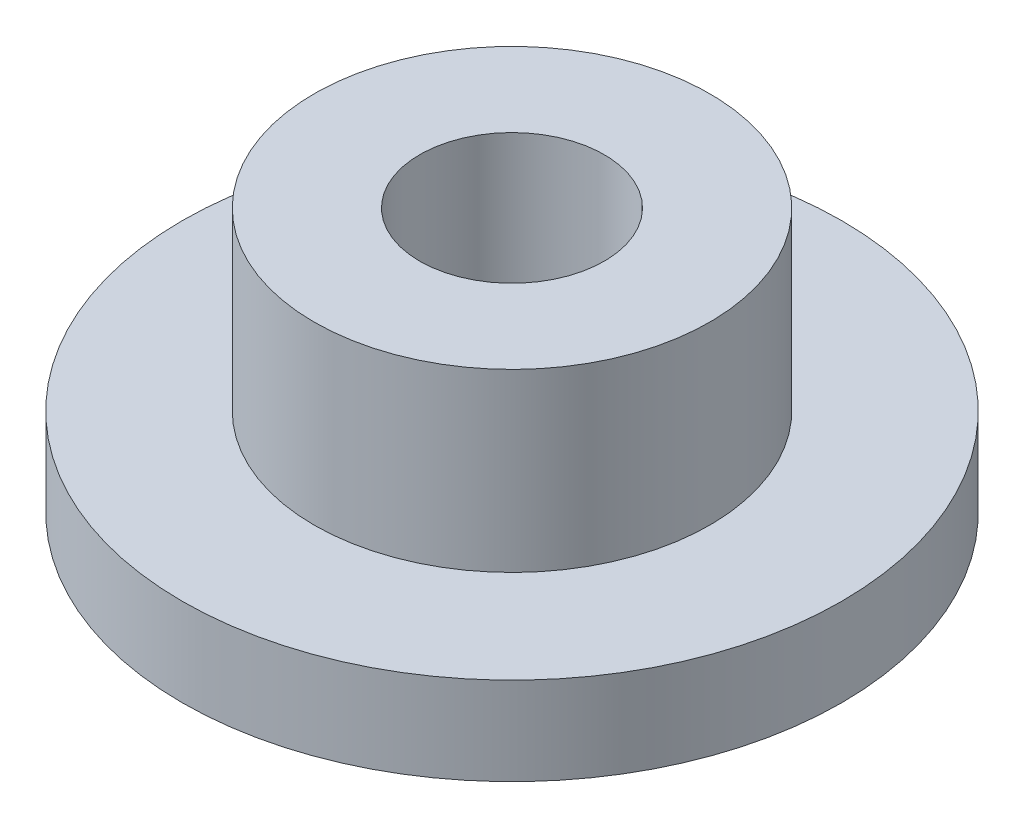
ISO-10303-21;
HEADER;
FILE_DESCRIPTION(('STEP AP214'),'2;1');
FILE_NAME('part.step','',(''),(''),'','','');
FILE_SCHEMA(('AUTOMOTIVE_DESIGN { 1 0 10303 214 1 1 1 1 }'));
ENDSEC;
DATA;
#1=APPLICATION_CONTEXT('core data for automotive mechanical design processes');
#2=APPLICATION_PROTOCOL_DEFINITION('international standard','automotive_design',2000,#1);
#3=PRODUCT_CONTEXT('',#1,'mechanical');
#4=PRODUCT('Part','Part','',(#3));
#5=PRODUCT_RELATED_PRODUCT_CATEGORY('part','',(#4));
#6=PRODUCT_DEFINITION_FORMATION('','',#4);
#7=PRODUCT_DEFINITION_CONTEXT('part definition',#1,'design');
#8=PRODUCT_DEFINITION('design','',#6,#7);
#9=PRODUCT_DEFINITION_SHAPE('','',#8);
#10=(LENGTH_UNIT() NAMED_UNIT(*) SI_UNIT(.MILLI.,.METRE.));
#11=(NAMED_UNIT(*) PLANE_ANGLE_UNIT() SI_UNIT($,.RADIAN.));
#12=(NAMED_UNIT(*) SI_UNIT($,.STERADIAN.) SOLID_ANGLE_UNIT());
#13=UNCERTAINTY_MEASURE_WITH_UNIT(LENGTH_MEASURE(1.E-05),#10,'distance_accuracy_value','');
#14=(GEOMETRIC_REPRESENTATION_CONTEXT(3) GLOBAL_UNCERTAINTY_ASSIGNED_CONTEXT((#13)) GLOBAL_UNIT_ASSIGNED_CONTEXT((#10,
#11,#12)) REPRESENTATION_CONTEXT('',''));
#15=CARTESIAN_POINT('',(0.,0.,0.));
#16=DIRECTION('',(0.,0.,1.));
#17=DIRECTION('',(1.,0.,0.));
#18=AXIS2_PLACEMENT_3D('',#15,#16,#17);
#19=CARTESIAN_POINT('',(0.,1.,0.));
#20=DIRECTION('',(0.,-1.,0.));
#21=DIRECTION('',(0.,0.,-1.));
#22=AXIS2_PLACEMENT_3D('',#19,#20,#21);
#23=CYLINDRICAL_SURFACE('',#22,3.75);
#24=CARTESIAN_POINT('',(0.,1.,0.));
#25=DIRECTION('',(0.,1.,0.));
#26=DIRECTION('',(0.,0.,1.));
#27=AXIS2_PLACEMENT_3D('',#24,#25,#26);
#28=CIRCLE('',#27,3.75);
#29=CARTESIAN_POINT('',(0.,1.,3.75));
#30=VERTEX_POINT('',#29);
#31=EDGE_CURVE('E47',#30,#30,#28,.T.);
#32=ORIENTED_EDGE('',*,*,#31,.F.);
#33=EDGE_LOOP('',(#32));
#34=FACE_BOUND('',#33,.T.);
#35=CARTESIAN_POINT('',(0.,0.,0.));
#36=DIRECTION('',(0.,1.,0.));
#37=DIRECTION('',(0.,0.,1.));
#38=AXIS2_PLACEMENT_3D('',#35,#36,#37);
#39=CIRCLE('',#38,3.75);
#40=CARTESIAN_POINT('',(0.,0.,3.75));
#41=VERTEX_POINT('',#40);
#42=EDGE_CURVE('E42',#41,#41,#39,.T.);
#43=ORIENTED_EDGE('',*,*,#42,.T.);
#44=EDGE_LOOP('',(#43));
#45=FACE_BOUND('',#44,.T.);
#46=ADVANCED_FACE('F39',(#34,#45),#23,.T.);
#47=CARTESIAN_POINT('',(0.,1.,0.));
#48=DIRECTION('',(0.,1.,0.));
#49=DIRECTION('',(0.,0.,1.));
#50=AXIS2_PLACEMENT_3D('',#47,#48,#49);
#51=PLANE('',#50);
#52=CARTESIAN_POINT('',(0.,1.,0.));
#53=DIRECTION('',(0.,1.,0.));
#54=DIRECTION('',(0.,0.,1.));
#55=AXIS2_PLACEMENT_3D('',#52,#53,#54);
#56=CIRCLE('',#55,2.25);
#57=CARTESIAN_POINT('',(0.,1.,2.25));
#58=VERTEX_POINT('',#57);
#59=EDGE_CURVE('E10',#58,#58,#56,.T.);
#60=ORIENTED_EDGE('',*,*,#59,.F.);
#61=EDGE_LOOP('',(#60));
#62=FACE_BOUND('',#61,.T.);
#63=ORIENTED_EDGE('',*,*,#31,.T.);
#64=EDGE_LOOP('',(#63));
#65=FACE_BOUND('',#64,.T.);
#66=ADVANCED_FACE('F82',(#62,#65),#51,.T.);
#67=CARTESIAN_POINT('',(0.,0.,0.));
#68=DIRECTION('',(0.,1.,0.));
#69=DIRECTION('',(0.,0.,1.));
#70=AXIS2_PLACEMENT_3D('',#67,#68,#69);
#71=PLANE('',#70);
#72=CARTESIAN_POINT('',(0.,0.,0.));
#73=DIRECTION('',(0.,1.,0.));
#74=DIRECTION('',(0.,0.,1.));
#75=AXIS2_PLACEMENT_3D('',#72,#73,#74);
#76=CIRCLE('',#75,1.05);
#77=CARTESIAN_POINT('',(0.,0.,1.05));
#78=VERTEX_POINT('',#77);
#79=EDGE_CURVE('E58',#78,#78,#76,.F.);
#80=ORIENTED_EDGE('',*,*,#79,.F.);
#81=EDGE_LOOP('',(#80));
#82=FACE_BOUND('',#81,.T.);
#83=ORIENTED_EDGE('',*,*,#42,.F.);
#84=EDGE_LOOP('',(#83));
#85=FACE_BOUND('',#84,.T.);
#86=ADVANCED_FACE('F77',(#82,#85),#71,.F.);
#87=CARTESIAN_POINT('',(0.,3.,0.));
#88=DIRECTION('',(0.,-1.,0.));
#89=DIRECTION('',(0.,0.,-1.));
#90=AXIS2_PLACEMENT_3D('',#87,#88,#89);
#91=CYLINDRICAL_SURFACE('',#90,2.25);
#92=CARTESIAN_POINT('',(0.,3.,0.));
#93=DIRECTION('',(0.,1.,0.));
#94=DIRECTION('',(0.,0.,1.));
#95=AXIS2_PLACEMENT_3D('',#92,#93,#94);
#96=CIRCLE('',#95,2.25);
#97=CARTESIAN_POINT('',(0.,3.,2.25));
#98=VERTEX_POINT('',#97);
#99=EDGE_CURVE('E54',#98,#98,#96,.T.);
#100=ORIENTED_EDGE('',*,*,#99,.F.);
#101=EDGE_LOOP('',(#100));
#102=FACE_BOUND('',#101,.T.);
#103=ORIENTED_EDGE('',*,*,#59,.T.);
#104=EDGE_LOOP('',(#103));
#105=FACE_BOUND('',#104,.T.);
#106=ADVANCED_FACE('F72',(#102,#105),#91,.T.);
#107=CARTESIAN_POINT('',(0.,3.,0.));
#108=DIRECTION('',(0.,1.,0.));
#109=DIRECTION('',(0.,0.,1.));
#110=AXIS2_PLACEMENT_3D('',#107,#108,#109);
#111=PLANE('',#110);
#112=CARTESIAN_POINT('',(0.,3.,0.));
#113=DIRECTION('',(0.,1.,0.));
#114=DIRECTION('',(0.,0.,1.));
#115=AXIS2_PLACEMENT_3D('',#112,#113,#114);
#116=CIRCLE('',#115,1.05);
#117=CARTESIAN_POINT('',(0.,3.,1.05));
#118=VERTEX_POINT('',#117);
#119=EDGE_CURVE('E62',#118,#118,#116,.T.);
#120=ORIENTED_EDGE('',*,*,#119,.F.);
#121=EDGE_LOOP('',(#120));
#122=FACE_BOUND('',#121,.T.);
#123=ORIENTED_EDGE('',*,*,#99,.T.);
#124=EDGE_LOOP('',(#123));
#125=FACE_BOUND('',#124,.T.);
#126=ADVANCED_FACE('F69',(#122,#125),#111,.T.);
#127=CARTESIAN_POINT('',(0.,-2.9698484809835,0.));
#128=DIRECTION('',(0.,1.,0.));
#129=DIRECTION('',(0.,0.,1.));
#130=AXIS2_PLACEMENT_3D('',#127,#128,#129);
#131=CYLINDRICAL_SURFACE('',#130,1.05);
#132=ORIENTED_EDGE('',*,*,#79,.T.);
#133=EDGE_LOOP('',(#132));
#134=FACE_BOUND('',#133,.T.);
#135=ORIENTED_EDGE('',*,*,#119,.T.);
#136=EDGE_LOOP('',(#135));
#137=FACE_BOUND('',#136,.T.);
#138=ADVANCED_FACE('F67',(#134,#137),#131,.F.);
#139=CLOSED_SHELL('',(#46,#66,#86,#106,#126,#138));
#140=MANIFOLD_SOLID_BREP('B2',#139);
#141=ADVANCED_BREP_SHAPE_REPRESENTATION('',(#18,#140),#14);
#142=SHAPE_DEFINITION_REPRESENTATION(#9,#141);
ENDSEC;
END-ISO-10303-21;
